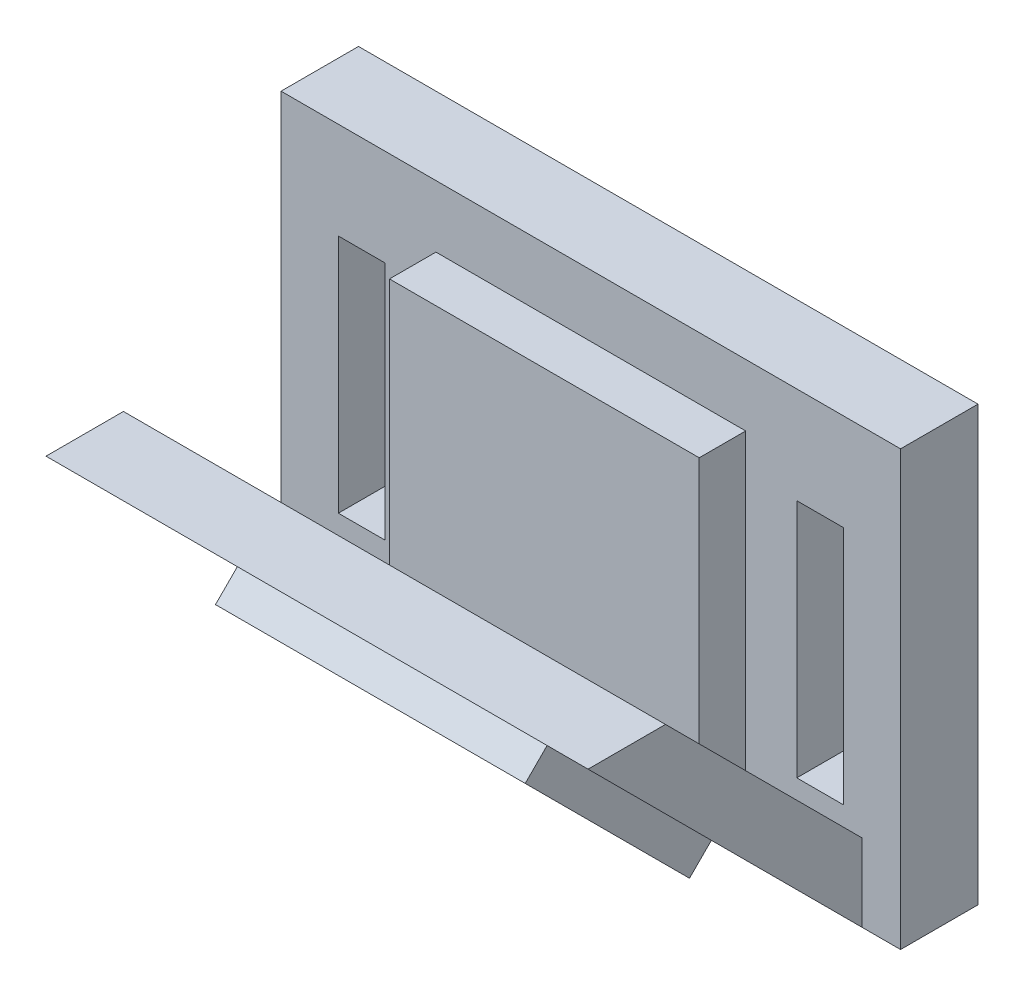
ISO-10303-21;
HEADER;
FILE_DESCRIPTION(('STEP AP214'),'2;1');
FILE_NAME('part.step','',(''),(''),'','','');
FILE_SCHEMA(('AUTOMOTIVE_DESIGN { 1 0 10303 214 1 1 1 1 }'));
ENDSEC;
DATA;
#1=APPLICATION_CONTEXT('core data for automotive mechanical design processes');
#2=APPLICATION_PROTOCOL_DEFINITION('international standard','automotive_design',2000,#1);
#3=PRODUCT_CONTEXT('',#1,'mechanical');
#4=PRODUCT('Part','Part','',(#3));
#5=PRODUCT_RELATED_PRODUCT_CATEGORY('part','',(#4));
#6=PRODUCT_DEFINITION_FORMATION('','',#4);
#7=PRODUCT_DEFINITION_CONTEXT('part definition',#1,'design');
#8=PRODUCT_DEFINITION('design','',#6,#7);
#9=PRODUCT_DEFINITION_SHAPE('','',#8);
#10=(LENGTH_UNIT() NAMED_UNIT(*) SI_UNIT(.MILLI.,.METRE.));
#11=(NAMED_UNIT(*) PLANE_ANGLE_UNIT() SI_UNIT($,.RADIAN.));
#12=(NAMED_UNIT(*) SI_UNIT($,.STERADIAN.) SOLID_ANGLE_UNIT());
#13=UNCERTAINTY_MEASURE_WITH_UNIT(LENGTH_MEASURE(1.E-05),#10,'distance_accuracy_value','');
#14=(GEOMETRIC_REPRESENTATION_CONTEXT(3) GLOBAL_UNCERTAINTY_ASSIGNED_CONTEXT((#13)) GLOBAL_UNIT_ASSIGNED_CONTEXT((#10,
#11,#12)) REPRESENTATION_CONTEXT('',''));
#15=CARTESIAN_POINT('',(0.,0.,0.));
#16=DIRECTION('',(0.,0.,1.));
#17=DIRECTION('',(1.,0.,0.));
#18=AXIS2_PLACEMENT_3D('',#15,#16,#17);
#19=CARTESIAN_POINT('',(17.5,-14.,2.5));
#20=DIRECTION('',(0.,0.707106781186544,-0.707106781186551));
#21=DIRECTION('',(0.,0.707106781186551,0.707106781186544));
#22=AXIS2_PLACEMENT_3D('',#19,#20,#21);
#23=PLANE('',#22);
#24=DIRECTION('',(0.,-0.707106781186551,-0.707106781186544));
#25=VECTOR('',#24,1.);
#26=CARTESIAN_POINT('',(-17.5,-14.,2.5));
#27=LINE('',#26,#25);
#28=CARTESIAN_POINT('',(-17.5,3.67766952966378,20.1776695296636));
#29=VERTEX_POINT('',#28);
#30=CARTESIAN_POINT('',(-17.5,-14.,2.5));
#31=VERTEX_POINT('',#30);
#32=EDGE_CURVE('E240',#29,#31,#27,.T.);
#33=ORIENTED_EDGE('',*,*,#32,.T.);
#34=DIRECTION('',(-1.,0.,0.));
#35=VECTOR('',#34,1.);
#36=CARTESIAN_POINT('',(17.5,-14.,2.5));
#37=LINE('',#36,#35);
#38=CARTESIAN_POINT('',(17.5,-14.,2.5));
#39=VERTEX_POINT('',#38);
#40=EDGE_CURVE('E249',#39,#31,#37,.T.);
#41=ORIENTED_EDGE('',*,*,#40,.F.);
#42=DIRECTION('',(0.,-0.707106781186551,-0.707106781186544));
#43=VECTOR('',#42,1.);
#44=CARTESIAN_POINT('',(17.5,-14.,2.5));
#45=LINE('',#44,#43);
#46=CARTESIAN_POINT('',(17.5,3.67766952966378,20.1776695296636));
#47=VERTEX_POINT('',#46);
#48=EDGE_CURVE('E246',#47,#39,#45,.T.);
#49=ORIENTED_EDGE('',*,*,#48,.F.);
#50=DIRECTION('',(-1.,0.,0.));
#51=VECTOR('',#50,1.);
#52=CARTESIAN_POINT('',(17.5,3.67766952966378,20.1776695296636));
#53=LINE('',#52,#51);
#54=EDGE_CURVE('E261',#47,#29,#53,.T.);
#55=ORIENTED_EDGE('',*,*,#54,.T.);
#56=EDGE_LOOP('',(#33,#41,#49,#55));
#57=FACE_BOUND('',#56,.T.);
#58=DIRECTION('',(0.,-0.707106781186551,-0.707106781186544));
#59=VECTOR('',#58,1.);
#60=CARTESIAN_POINT('',(-10.,-1.17893218813442,15.3210678118655));
#61=LINE('',#60,#59);
#62=CARTESIAN_POINT('',(-10.,-1.17893218813442,15.3210678118655));
#63=VERTEX_POINT('',#62);
#64=CARTESIAN_POINT('',(-10.,-11.7855339059327,4.71446609406729));
#65=VERTEX_POINT('',#64);
#66=EDGE_CURVE('E223',#63,#65,#61,.T.);
#67=ORIENTED_EDGE('',*,*,#66,.F.);
#68=DIRECTION('',(-1.,0.,0.));
#69=VECTOR('',#68,1.);
#70=CARTESIAN_POINT('',(-10.,-1.17893218813442,15.3210678118655));
#71=LINE('',#70,#69);
#72=CARTESIAN_POINT('',(10.,-1.17893218813442,15.3210678118655));
#73=VERTEX_POINT('',#72);
#74=EDGE_CURVE('E220',#73,#63,#71,.T.);
#75=ORIENTED_EDGE('',*,*,#74,.F.);
#76=DIRECTION('',(0.,0.707106781186551,0.707106781186544));
#77=VECTOR('',#76,1.);
#78=CARTESIAN_POINT('',(10.,-1.17893218813442,15.3210678118655));
#79=LINE('',#78,#77);
#80=CARTESIAN_POINT('',(10.,-11.7855339059327,4.71446609406729));
#81=VERTEX_POINT('',#80);
#82=EDGE_CURVE('E60',#81,#73,#79,.T.);
#83=ORIENTED_EDGE('',*,*,#82,.F.);
#84=DIRECTION('',(1.,0.,0.));
#85=VECTOR('',#84,1.);
#86=CARTESIAN_POINT('',(-10.,-11.7855339059327,4.71446609406729));
#87=LINE('',#86,#85);
#88=EDGE_CURVE('E55',#65,#81,#87,.T.);
#89=ORIENTED_EDGE('',*,*,#88,.F.);
#90=EDGE_LOOP('',(#67,#75,#83,#89));
#91=FACE_BOUND('',#90,.T.);
#92=ADVANCED_FACE('F39',(#57,#91),#23,.F.);
#93=CARTESIAN_POINT('',(0.,0.,2.5));
#94=DIRECTION('',(0.,0.,-1.));
#95=DIRECTION('',(-1.,0.,0.));
#96=AXIS2_PLACEMENT_3D('',#93,#94,#95);
#97=PLANE('',#96);
#98=DIRECTION('',(0.,1.,0.));
#99=VECTOR('',#98,1.);
#100=CARTESIAN_POINT('',(16.3,-7.74999999999999,2.5));
#101=LINE('',#100,#99);
#102=CARTESIAN_POINT('',(16.3,-7.74999999999999,2.5));
#103=VERTEX_POINT('',#102);
#104=CARTESIAN_POINT('',(16.3,7.75,2.5));
#105=VERTEX_POINT('',#104);
#106=EDGE_CURVE('E354',#103,#105,#101,.T.);
#107=ORIENTED_EDGE('',*,*,#106,.F.);
#108=DIRECTION('',(1.,0.,0.));
#109=VECTOR('',#108,1.);
#110=CARTESIAN_POINT('',(13.3,-7.74999999999999,2.5));
#111=LINE('',#110,#109);
#112=CARTESIAN_POINT('',(13.3,-7.74999999999999,2.5));
#113=VERTEX_POINT('',#112);
#114=EDGE_CURVE('E365',#113,#103,#111,.T.);
#115=ORIENTED_EDGE('',*,*,#114,.F.);
#116=DIRECTION('',(0.,-1.,0.));
#117=VECTOR('',#116,1.);
#118=CARTESIAN_POINT('',(13.3,-7.74999999999999,2.5));
#119=LINE('',#118,#117);
#120=CARTESIAN_POINT('',(13.3,7.75,2.5));
#121=VERTEX_POINT('',#120);
#122=EDGE_CURVE('E361',#121,#113,#119,.T.);
#123=ORIENTED_EDGE('',*,*,#122,.F.);
#124=DIRECTION('',(-1.,0.,0.));
#125=VECTOR('',#124,1.);
#126=CARTESIAN_POINT('',(13.3,7.75,2.5));
#127=LINE('',#126,#125);
#128=EDGE_CURVE('E357',#105,#121,#127,.T.);
#129=ORIENTED_EDGE('',*,*,#128,.F.);
#130=EDGE_LOOP('',(#107,#115,#123,#129));
#131=FACE_BOUND('',#130,.T.);
#132=DIRECTION('',(0.,1.,0.));
#133=VECTOR('',#132,1.);
#134=CARTESIAN_POINT('',(-13.3,-7.75,2.5));
#135=LINE('',#134,#133);
#136=CARTESIAN_POINT('',(-13.3,-7.75,2.5));
#137=VERTEX_POINT('',#136);
#138=CARTESIAN_POINT('',(-13.3,7.75,2.5));
#139=VERTEX_POINT('',#138);
#140=EDGE_CURVE('E311',#137,#139,#135,.T.);
#141=ORIENTED_EDGE('',*,*,#140,.F.);
#142=DIRECTION('',(1.,0.,0.));
#143=VECTOR('',#142,1.);
#144=CARTESIAN_POINT('',(-16.3,-7.75,2.5));
#145=LINE('',#144,#143);
#146=CARTESIAN_POINT('',(-16.3,-7.75,2.5));
#147=VERTEX_POINT('',#146);
#148=EDGE_CURVE('E322',#147,#137,#145,.T.);
#149=ORIENTED_EDGE('',*,*,#148,.F.);
#150=DIRECTION('',(0.,-1.,0.));
#151=VECTOR('',#150,1.);
#152=CARTESIAN_POINT('',(-16.3,-7.75,2.5));
#153=LINE('',#152,#151);
#154=CARTESIAN_POINT('',(-16.3,7.75,2.5));
#155=VERTEX_POINT('',#154);
#156=EDGE_CURVE('E318',#155,#147,#153,.T.);
#157=ORIENTED_EDGE('',*,*,#156,.F.);
#158=DIRECTION('',(-1.,0.,0.));
#159=VECTOR('',#158,1.);
#160=CARTESIAN_POINT('',(-16.3,7.75,2.5));
#161=LINE('',#160,#159);
#162=EDGE_CURVE('E314',#139,#155,#161,.T.);
#163=ORIENTED_EDGE('',*,*,#162,.F.);
#164=EDGE_LOOP('',(#141,#149,#157,#163));
#165=FACE_BOUND('',#164,.T.);
#166=DIRECTION('',(-1.,0.,0.));
#167=VECTOR('',#166,1.);
#168=CARTESIAN_POINT('',(17.5,-8.99999999999996,2.5));
#169=LINE('',#168,#167);
#170=CARTESIAN_POINT('',(17.5,-8.99999999999996,2.5));
#171=VERTEX_POINT('',#170);
#172=CARTESIAN_POINT('',(10.,-8.99999999999996,2.5));
#173=VERTEX_POINT('',#172);
#174=EDGE_CURVE('E270',#171,#173,#169,.T.);
#175=ORIENTED_EDGE('',*,*,#174,.F.);
#176=DIRECTION('',(0.,1.,0.));
#177=VECTOR('',#176,1.);
#178=CARTESIAN_POINT('',(17.5,-8.99999999999996,2.5));
#179=LINE('',#178,#177);
#180=EDGE_CURVE('E235',#39,#171,#179,.T.);
#181=ORIENTED_EDGE('',*,*,#180,.F.);
#182=DIRECTION('',(1.,0.,0.));
#183=VECTOR('',#182,1.);
#184=CARTESIAN_POINT('',(-20.,-14.,2.5));
#185=LINE('',#184,#183);
#186=CARTESIAN_POINT('',(20.,-14.,2.5));
#187=VERTEX_POINT('',#186);
#188=EDGE_CURVE('E408',#39,#187,#185,.T.);
#189=ORIENTED_EDGE('',*,*,#188,.T.);
#190=DIRECTION('',(0.,1.,0.));
#191=VECTOR('',#190,1.);
#192=CARTESIAN_POINT('',(20.,-14.,2.5));
#193=LINE('',#192,#191);
#194=CARTESIAN_POINT('',(20.,14.,2.5));
#195=VERTEX_POINT('',#194);
#196=EDGE_CURVE('E397',#187,#195,#193,.T.);
#197=ORIENTED_EDGE('',*,*,#196,.T.);
#198=DIRECTION('',(-1.,0.,0.));
#199=VECTOR('',#198,1.);
#200=CARTESIAN_POINT('',(-20.,14.,2.5));
#201=LINE('',#200,#199);
#202=CARTESIAN_POINT('',(-20.,14.,2.5));
#203=VERTEX_POINT('',#202);
#204=EDGE_CURVE('E401',#195,#203,#201,.T.);
#205=ORIENTED_EDGE('',*,*,#204,.T.);
#206=DIRECTION('',(0.,-1.,0.));
#207=VECTOR('',#206,1.);
#208=CARTESIAN_POINT('',(-20.,-14.,2.5));
#209=LINE('',#208,#207);
#210=CARTESIAN_POINT('',(-20.,-14.,2.5));
#211=VERTEX_POINT('',#210);
#212=EDGE_CURVE('E405',#203,#211,#209,.T.);
#213=ORIENTED_EDGE('',*,*,#212,.T.);
#214=EDGE_CURVE('E409',#211,#31,#185,.T.);
#215=ORIENTED_EDGE('',*,*,#214,.T.);
#216=DIRECTION('',(0.,1.,0.));
#217=VECTOR('',#216,1.);
#218=CARTESIAN_POINT('',(-17.5,-8.99999999999996,2.5));
#219=LINE('',#218,#217);
#220=CARTESIAN_POINT('',(-17.5,-8.99999999999996,2.5));
#221=VERTEX_POINT('',#220);
#222=EDGE_CURVE('E225',#31,#221,#219,.T.);
#223=ORIENTED_EDGE('',*,*,#222,.T.);
#224=CARTESIAN_POINT('',(-10.,-8.99999999999996,2.5));
#225=VERTEX_POINT('',#224);
#226=EDGE_CURVE('E269',#225,#221,#169,.T.);
#227=ORIENTED_EDGE('',*,*,#226,.F.);
#228=DIRECTION('',(0.,-1.,0.));
#229=VECTOR('',#228,1.);
#230=CARTESIAN_POINT('',(-10.,-10.,2.5));
#231=LINE('',#230,#229);
#232=CARTESIAN_POINT('',(-10.,10.,2.5));
#233=VERTEX_POINT('',#232);
#234=EDGE_CURVE('E287',#233,#225,#231,.T.);
#235=ORIENTED_EDGE('',*,*,#234,.F.);
#236=DIRECTION('',(-1.,0.,0.));
#237=VECTOR('',#236,1.);
#238=CARTESIAN_POINT('',(-10.,10.,2.5));
#239=LINE('',#238,#237);
#240=CARTESIAN_POINT('',(10.,10.,2.5));
#241=VERTEX_POINT('',#240);
#242=EDGE_CURVE('E296',#241,#233,#239,.T.);
#243=ORIENTED_EDGE('',*,*,#242,.F.);
#244=DIRECTION('',(0.,1.,0.));
#245=VECTOR('',#244,1.);
#246=CARTESIAN_POINT('',(10.,-10.,2.5));
#247=LINE('',#246,#245);
#248=EDGE_CURVE('E282',#173,#241,#247,.T.);
#249=ORIENTED_EDGE('',*,*,#248,.F.);
#250=EDGE_LOOP('',(#175,#181,#189,#197,#205,#213,#215,#223,#227,#235,#243,#249));
#251=FACE_BOUND('',#250,.T.);
#252=ADVANCED_FACE('F460',(#131,#165,#251),#97,.F.);
#253=CARTESIAN_POINT('',(10.,-10.,5.5));
#254=DIRECTION('',(-1.,0.,0.));
#255=DIRECTION('',(0.,0.,1.));
#256=AXIS2_PLACEMENT_3D('',#253,#254,#255);
#257=PLANE('',#256);
#258=DIRECTION('',(0.,0.707106781186551,0.707106781186544));
#259=VECTOR('',#258,1.);
#260=CARTESIAN_POINT('',(10.,-7.99999999999998,3.49999999999996));
#261=LINE('',#260,#259);
#262=CARTESIAN_POINT('',(10.,-5.99999999999993,5.5));
#263=VERTEX_POINT('',#262);
#264=EDGE_CURVE('E278',#173,#263,#261,.T.);
#265=ORIENTED_EDGE('',*,*,#264,.F.);
#266=ORIENTED_EDGE('',*,*,#248,.T.);
#267=DIRECTION('',(0.,0.,-1.));
#268=VECTOR('',#267,1.);
#269=CARTESIAN_POINT('',(10.,10.,5.5));
#270=LINE('',#269,#268);
#271=CARTESIAN_POINT('',(10.,10.,5.5));
#272=VERTEX_POINT('',#271);
#273=EDGE_CURVE('E306',#272,#241,#270,.T.);
#274=ORIENTED_EDGE('',*,*,#273,.F.);
#275=DIRECTION('',(0.,1.,0.));
#276=VECTOR('',#275,1.);
#277=CARTESIAN_POINT('',(10.,-10.,5.5));
#278=LINE('',#277,#276);
#279=EDGE_CURVE('E283',#263,#272,#278,.T.);
#280=ORIENTED_EDGE('',*,*,#279,.F.);
#281=EDGE_LOOP('',(#265,#266,#274,#280));
#282=FACE_BOUND('',#281,.T.);
#283=ADVANCED_FACE('F484',(#282),#257,.F.);
#284=CARTESIAN_POINT('',(-10.,-10.,5.5));
#285=DIRECTION('',(1.,0.,0.));
#286=DIRECTION('',(0.,0.,-1.));
#287=AXIS2_PLACEMENT_3D('',#284,#285,#286);
#288=PLANE('',#287);
#289=DIRECTION('',(0.,-0.707106781186551,-0.707106781186544));
#290=VECTOR('',#289,1.);
#291=CARTESIAN_POINT('',(-10.,-7.99999999999998,3.49999999999996));
#292=LINE('',#291,#290);
#293=CARTESIAN_POINT('',(-10.,-5.99999999999993,5.5));
#294=VERTEX_POINT('',#293);
#295=EDGE_CURVE('E274',#294,#225,#292,.T.);
#296=ORIENTED_EDGE('',*,*,#295,.F.);
#297=DIRECTION('',(0.,-1.,0.));
#298=VECTOR('',#297,1.);
#299=CARTESIAN_POINT('',(-10.,-10.,5.5));
#300=LINE('',#299,#298);
#301=CARTESIAN_POINT('',(-10.,10.,5.5));
#302=VERTEX_POINT('',#301);
#303=EDGE_CURVE('E290',#302,#294,#300,.T.);
#304=ORIENTED_EDGE('',*,*,#303,.F.);
#305=DIRECTION('',(0.,0.,-1.));
#306=VECTOR('',#305,1.);
#307=CARTESIAN_POINT('',(-10.,10.,5.5));
#308=LINE('',#307,#306);
#309=EDGE_CURVE('E293',#302,#233,#308,.T.);
#310=ORIENTED_EDGE('',*,*,#309,.T.);
#311=ORIENTED_EDGE('',*,*,#234,.T.);
#312=EDGE_LOOP('',(#296,#304,#310,#311));
#313=FACE_BOUND('',#312,.T.);
#314=ADVANCED_FACE('F495',(#313),#288,.F.);
#315=CARTESIAN_POINT('',(0.,0.,5.5));
#316=DIRECTION('',(0.,0.,-1.));
#317=DIRECTION('',(-1.,0.,0.));
#318=AXIS2_PLACEMENT_3D('',#315,#316,#317);
#319=PLANE('',#318);
#320=DIRECTION('',(-1.,0.,0.));
#321=VECTOR('',#320,1.);
#322=CARTESIAN_POINT('',(0.,-5.99999999999993,5.5));
#323=LINE('',#322,#321);
#324=EDGE_CURVE('E11',#263,#294,#323,.T.);
#325=ORIENTED_EDGE('',*,*,#324,.F.);
#326=ORIENTED_EDGE('',*,*,#279,.T.);
#327=DIRECTION('',(-1.,0.,0.));
#328=VECTOR('',#327,1.);
#329=CARTESIAN_POINT('',(-10.,10.,5.5));
#330=LINE('',#329,#328);
#331=EDGE_CURVE('E286',#272,#302,#330,.T.);
#332=ORIENTED_EDGE('',*,*,#331,.T.);
#333=ORIENTED_EDGE('',*,*,#303,.T.);
#334=EDGE_LOOP('',(#325,#326,#332,#333));
#335=FACE_BOUND('',#334,.T.);
#336=ADVANCED_FACE('F488',(#335),#319,.F.);
#337=CARTESIAN_POINT('',(0.,0.,-2.5));
#338=DIRECTION('',(0.,0.,-1.));
#339=DIRECTION('',(-1.,0.,0.));
#340=AXIS2_PLACEMENT_3D('',#337,#338,#339);
#341=PLANE('',#340);
#342=DIRECTION('',(0.,1.,0.));
#343=VECTOR('',#342,1.);
#344=CARTESIAN_POINT('',(20.,-14.,-2.5));
#345=LINE('',#344,#343);
#346=CARTESIAN_POINT('',(20.,-14.,-2.5));
#347=VERTEX_POINT('',#346);
#348=CARTESIAN_POINT('',(20.,14.,-2.5));
#349=VERTEX_POINT('',#348);
#350=EDGE_CURVE('E396',#347,#349,#345,.T.);
#351=ORIENTED_EDGE('',*,*,#350,.F.);
#352=DIRECTION('',(1.,0.,0.));
#353=VECTOR('',#352,1.);
#354=CARTESIAN_POINT('',(-20.,-14.,-2.5));
#355=LINE('',#354,#353);
#356=CARTESIAN_POINT('',(-20.,-14.,-2.5));
#357=VERTEX_POINT('',#356);
#358=EDGE_CURVE('E402',#357,#347,#355,.T.);
#359=ORIENTED_EDGE('',*,*,#358,.F.);
#360=DIRECTION('',(0.,-1.,0.));
#361=VECTOR('',#360,1.);
#362=CARTESIAN_POINT('',(-20.,-14.,-2.5));
#363=LINE('',#362,#361);
#364=CARTESIAN_POINT('',(-20.,14.,-2.5));
#365=VERTEX_POINT('',#364);
#366=EDGE_CURVE('E420',#365,#357,#363,.T.);
#367=ORIENTED_EDGE('',*,*,#366,.F.);
#368=DIRECTION('',(-1.,0.,0.));
#369=VECTOR('',#368,1.);
#370=CARTESIAN_POINT('',(-20.,14.,-2.5));
#371=LINE('',#370,#369);
#372=EDGE_CURVE('E417',#349,#365,#371,.T.);
#373=ORIENTED_EDGE('',*,*,#372,.F.);
#374=EDGE_LOOP('',(#351,#359,#367,#373));
#375=FACE_BOUND('',#374,.T.);
#376=DIRECTION('',(1.,0.,0.));
#377=VECTOR('',#376,1.);
#378=CARTESIAN_POINT('',(13.3,-7.74999999999999,-2.5));
#379=LINE('',#378,#377);
#380=CARTESIAN_POINT('',(13.3,-7.74999999999999,-2.5));
#381=VERTEX_POINT('',#380);
#382=CARTESIAN_POINT('',(16.3,-7.74999999999999,-2.5));
#383=VERTEX_POINT('',#382);
#384=EDGE_CURVE('E358',#381,#383,#379,.T.);
#385=ORIENTED_EDGE('',*,*,#384,.T.);
#386=DIRECTION('',(0.,1.,0.));
#387=VECTOR('',#386,1.);
#388=CARTESIAN_POINT('',(16.3,-7.74999999999999,-2.5));
#389=LINE('',#388,#387);
#390=CARTESIAN_POINT('',(16.3,7.75,-2.5));
#391=VERTEX_POINT('',#390);
#392=EDGE_CURVE('E353',#383,#391,#389,.T.);
#393=ORIENTED_EDGE('',*,*,#392,.T.);
#394=DIRECTION('',(-1.,0.,0.));
#395=VECTOR('',#394,1.);
#396=CARTESIAN_POINT('',(13.3,7.75,-2.5));
#397=LINE('',#396,#395);
#398=CARTESIAN_POINT('',(13.3,7.75,-2.5));
#399=VERTEX_POINT('',#398);
#400=EDGE_CURVE('E372',#391,#399,#397,.T.);
#401=ORIENTED_EDGE('',*,*,#400,.T.);
#402=DIRECTION('',(0.,-1.,0.));
#403=VECTOR('',#402,1.);
#404=CARTESIAN_POINT('',(13.3,-7.74999999999999,-2.5));
#405=LINE('',#404,#403);
#406=EDGE_CURVE('E376',#399,#381,#405,.T.);
#407=ORIENTED_EDGE('',*,*,#406,.T.);
#408=EDGE_LOOP('',(#385,#393,#401,#407));
#409=FACE_BOUND('',#408,.T.);
#410=DIRECTION('',(1.,0.,0.));
#411=VECTOR('',#410,1.);
#412=CARTESIAN_POINT('',(-16.3,-7.75,-2.5));
#413=LINE('',#412,#411);
#414=CARTESIAN_POINT('',(-16.3,-7.75,-2.5));
#415=VERTEX_POINT('',#414);
#416=CARTESIAN_POINT('',(-13.3,-7.75,-2.5));
#417=VERTEX_POINT('',#416);
#418=EDGE_CURVE('E315',#415,#417,#413,.T.);
#419=ORIENTED_EDGE('',*,*,#418,.T.);
#420=DIRECTION('',(0.,1.,0.));
#421=VECTOR('',#420,1.);
#422=CARTESIAN_POINT('',(-13.3,-7.75,-2.5));
#423=LINE('',#422,#421);
#424=CARTESIAN_POINT('',(-13.3,7.75,-2.5));
#425=VERTEX_POINT('',#424);
#426=EDGE_CURVE('E310',#417,#425,#423,.T.);
#427=ORIENTED_EDGE('',*,*,#426,.T.);
#428=DIRECTION('',(-1.,0.,0.));
#429=VECTOR('',#428,1.);
#430=CARTESIAN_POINT('',(-16.3,7.75,-2.5));
#431=LINE('',#430,#429);
#432=CARTESIAN_POINT('',(-16.3,7.75,-2.5));
#433=VERTEX_POINT('',#432);
#434=EDGE_CURVE('E329',#425,#433,#431,.T.);
#435=ORIENTED_EDGE('',*,*,#434,.T.);
#436=DIRECTION('',(0.,-1.,0.));
#437=VECTOR('',#436,1.);
#438=CARTESIAN_POINT('',(-16.3,-7.75,-2.5));
#439=LINE('',#438,#437);
#440=EDGE_CURVE('E333',#433,#415,#439,.T.);
#441=ORIENTED_EDGE('',*,*,#440,.T.);
#442=EDGE_LOOP('',(#419,#427,#435,#441));
#443=FACE_BOUND('',#442,.T.);
#444=ADVANCED_FACE('F447',(#375,#409,#443),#341,.T.);
#445=CARTESIAN_POINT('',(20.,-14.,2.5));
#446=DIRECTION('',(-1.,0.,0.));
#447=DIRECTION('',(0.,0.,1.));
#448=AXIS2_PLACEMENT_3D('',#445,#446,#447);
#449=PLANE('',#448);
#450=ORIENTED_EDGE('',*,*,#350,.T.);
#451=DIRECTION('',(0.,0.,-1.));
#452=VECTOR('',#451,1.);
#453=CARTESIAN_POINT('',(20.,14.,2.5));
#454=LINE('',#453,#452);
#455=EDGE_CURVE('E48',#195,#349,#454,.T.);
#456=ORIENTED_EDGE('',*,*,#455,.F.);
#457=ORIENTED_EDGE('',*,*,#196,.F.);
#458=DIRECTION('',(0.,0.,-1.));
#459=VECTOR('',#458,1.);
#460=CARTESIAN_POINT('',(20.,-14.,2.5));
#461=LINE('',#460,#459);
#462=EDGE_CURVE('E413',#187,#347,#461,.T.);
#463=ORIENTED_EDGE('',*,*,#462,.T.);
#464=EDGE_LOOP('',(#450,#456,#457,#463));
#465=FACE_BOUND('',#464,.T.);
#466=ADVANCED_FACE('F41',(#465),#449,.F.);
#467=CARTESIAN_POINT('',(-20.,14.,2.5));
#468=DIRECTION('',(0.,-1.,0.));
#469=DIRECTION('',(0.,0.,-1.));
#470=AXIS2_PLACEMENT_3D('',#467,#468,#469);
#471=PLANE('',#470);
#472=ORIENTED_EDGE('',*,*,#372,.T.);
#473=DIRECTION('',(0.,0.,-1.));
#474=VECTOR('',#473,1.);
#475=CARTESIAN_POINT('',(-20.,14.,2.5));
#476=LINE('',#475,#474);
#477=EDGE_CURVE('E432',#203,#365,#476,.T.);
#478=ORIENTED_EDGE('',*,*,#477,.F.);
#479=ORIENTED_EDGE('',*,*,#204,.F.);
#480=ORIENTED_EDGE('',*,*,#455,.T.);
#481=EDGE_LOOP('',(#472,#478,#479,#480));
#482=FACE_BOUND('',#481,.T.);
#483=ADVANCED_FACE('F439',(#482),#471,.F.);
#484=CARTESIAN_POINT('',(-20.,-14.,2.5));
#485=DIRECTION('',(1.,0.,0.));
#486=DIRECTION('',(0.,0.,-1.));
#487=AXIS2_PLACEMENT_3D('',#484,#485,#486);
#488=PLANE('',#487);
#489=ORIENTED_EDGE('',*,*,#366,.T.);
#490=DIRECTION('',(0.,0.,-1.));
#491=VECTOR('',#490,1.);
#492=CARTESIAN_POINT('',(-20.,-14.,2.5));
#493=LINE('',#492,#491);
#494=EDGE_CURVE('E428',#211,#357,#493,.T.);
#495=ORIENTED_EDGE('',*,*,#494,.F.);
#496=ORIENTED_EDGE('',*,*,#212,.F.);
#497=ORIENTED_EDGE('',*,*,#477,.T.);
#498=EDGE_LOOP('',(#489,#495,#496,#497));
#499=FACE_BOUND('',#498,.T.);
#500=ADVANCED_FACE('F452',(#499),#488,.F.);
#501=CARTESIAN_POINT('',(-20.,-14.,2.5));
#502=DIRECTION('',(0.,1.,0.));
#503=DIRECTION('',(0.,0.,1.));
#504=AXIS2_PLACEMENT_3D('',#501,#502,#503);
#505=PLANE('',#504);
#506=ORIENTED_EDGE('',*,*,#358,.T.);
#507=ORIENTED_EDGE('',*,*,#462,.F.);
#508=ORIENTED_EDGE('',*,*,#188,.F.);
#509=ORIENTED_EDGE('',*,*,#40,.T.);
#510=ORIENTED_EDGE('',*,*,#214,.F.);
#511=ORIENTED_EDGE('',*,*,#494,.T.);
#512=EDGE_LOOP('',(#506,#507,#508,#509,#510,#511));
#513=FACE_BOUND('',#512,.T.);
#514=ADVANCED_FACE('F456',(#513),#505,.F.);
#515=CARTESIAN_POINT('',(16.3,-7.74999999999999,2.5));
#516=DIRECTION('',(-1.,0.,0.));
#517=DIRECTION('',(0.,0.,1.));
#518=AXIS2_PLACEMENT_3D('',#515,#516,#517);
#519=PLANE('',#518);
#520=ORIENTED_EDGE('',*,*,#392,.F.);
#521=DIRECTION('',(0.,0.,-1.));
#522=VECTOR('',#521,1.);
#523=CARTESIAN_POINT('',(16.3,-7.74999999999999,2.5));
#524=LINE('',#523,#522);
#525=EDGE_CURVE('E368',#103,#383,#524,.T.);
#526=ORIENTED_EDGE('',*,*,#525,.F.);
#527=ORIENTED_EDGE('',*,*,#106,.T.);
#528=DIRECTION('',(0.,0.,-1.));
#529=VECTOR('',#528,1.);
#530=CARTESIAN_POINT('',(16.3,7.75,2.5));
#531=LINE('',#530,#529);
#532=EDGE_CURVE('E392',#105,#391,#531,.T.);
#533=ORIENTED_EDGE('',*,*,#532,.T.);
#534=EDGE_LOOP('',(#520,#526,#527,#533));
#535=FACE_BOUND('',#534,.T.);
#536=ADVANCED_FACE('F555',(#535),#519,.T.);
#537=CARTESIAN_POINT('',(13.3,7.75,2.5));
#538=DIRECTION('',(0.,-1.,0.));
#539=DIRECTION('',(0.,0.,-1.));
#540=AXIS2_PLACEMENT_3D('',#537,#538,#539);
#541=PLANE('',#540);
#542=ORIENTED_EDGE('',*,*,#400,.F.);
#543=ORIENTED_EDGE('',*,*,#532,.F.);
#544=ORIENTED_EDGE('',*,*,#128,.T.);
#545=DIRECTION('',(0.,0.,-1.));
#546=VECTOR('',#545,1.);
#547=CARTESIAN_POINT('',(13.3,7.75,2.5));
#548=LINE('',#547,#546);
#549=EDGE_CURVE('E389',#121,#399,#548,.T.);
#550=ORIENTED_EDGE('',*,*,#549,.T.);
#551=EDGE_LOOP('',(#542,#543,#544,#550));
#552=FACE_BOUND('',#551,.T.);
#553=ADVANCED_FACE('F551',(#552),#541,.T.);
#554=CARTESIAN_POINT('',(13.3,-7.74999999999999,2.5));
#555=DIRECTION('',(1.,0.,0.));
#556=DIRECTION('',(0.,0.,-1.));
#557=AXIS2_PLACEMENT_3D('',#554,#555,#556);
#558=PLANE('',#557);
#559=ORIENTED_EDGE('',*,*,#406,.F.);
#560=ORIENTED_EDGE('',*,*,#549,.F.);
#561=ORIENTED_EDGE('',*,*,#122,.T.);
#562=DIRECTION('',(0.,0.,-1.));
#563=VECTOR('',#562,1.);
#564=CARTESIAN_POINT('',(13.3,-7.74999999999999,2.5));
#565=LINE('',#564,#563);
#566=EDGE_CURVE('E386',#113,#381,#565,.T.);
#567=ORIENTED_EDGE('',*,*,#566,.T.);
#568=EDGE_LOOP('',(#559,#560,#561,#567));
#569=FACE_BOUND('',#568,.T.);
#570=ADVANCED_FACE('F547',(#569),#558,.T.);
#571=CARTESIAN_POINT('',(13.3,-7.74999999999999,2.5));
#572=DIRECTION('',(0.,1.,0.));
#573=DIRECTION('',(-1.,0.,0.));
#574=AXIS2_PLACEMENT_3D('',#571,#572,#573);
#575=PLANE('',#574);
#576=ORIENTED_EDGE('',*,*,#384,.F.);
#577=ORIENTED_EDGE('',*,*,#566,.F.);
#578=ORIENTED_EDGE('',*,*,#114,.T.);
#579=ORIENTED_EDGE('',*,*,#525,.T.);
#580=EDGE_LOOP('',(#576,#577,#578,#579));
#581=FACE_BOUND('',#580,.T.);
#582=ADVANCED_FACE('F543',(#581),#575,.T.);
#583=CARTESIAN_POINT('',(-13.3,-7.75,2.5));
#584=DIRECTION('',(-1.,0.,0.));
#585=DIRECTION('',(0.,0.,1.));
#586=AXIS2_PLACEMENT_3D('',#583,#584,#585);
#587=PLANE('',#586);
#588=ORIENTED_EDGE('',*,*,#426,.F.);
#589=DIRECTION('',(0.,0.,-1.));
#590=VECTOR('',#589,1.);
#591=CARTESIAN_POINT('',(-13.3,-7.75,2.5));
#592=LINE('',#591,#590);
#593=EDGE_CURVE('E325',#137,#417,#592,.T.);
#594=ORIENTED_EDGE('',*,*,#593,.F.);
#595=ORIENTED_EDGE('',*,*,#140,.T.);
#596=DIRECTION('',(0.,0.,-1.));
#597=VECTOR('',#596,1.);
#598=CARTESIAN_POINT('',(-13.3,7.75,2.5));
#599=LINE('',#598,#597);
#600=EDGE_CURVE('E349',#139,#425,#599,.T.);
#601=ORIENTED_EDGE('',*,*,#600,.T.);
#602=EDGE_LOOP('',(#588,#594,#595,#601));
#603=FACE_BOUND('',#602,.T.);
#604=ADVANCED_FACE('F539',(#603),#587,.T.);
#605=CARTESIAN_POINT('',(-16.3,7.75,2.5));
#606=DIRECTION('',(0.,-1.,0.));
#607=DIRECTION('',(0.,0.,-1.));
#608=AXIS2_PLACEMENT_3D('',#605,#606,#607);
#609=PLANE('',#608);
#610=ORIENTED_EDGE('',*,*,#434,.F.);
#611=ORIENTED_EDGE('',*,*,#600,.F.);
#612=ORIENTED_EDGE('',*,*,#162,.T.);
#613=DIRECTION('',(0.,0.,-1.));
#614=VECTOR('',#613,1.);
#615=CARTESIAN_POINT('',(-16.3,7.75,2.5));
#616=LINE('',#615,#614);
#617=EDGE_CURVE('E346',#155,#433,#616,.T.);
#618=ORIENTED_EDGE('',*,*,#617,.T.);
#619=EDGE_LOOP('',(#610,#611,#612,#618));
#620=FACE_BOUND('',#619,.T.);
#621=ADVANCED_FACE('F535',(#620),#609,.T.);
#622=CARTESIAN_POINT('',(-16.3,-7.75,2.5));
#623=DIRECTION('',(1.,0.,0.));
#624=DIRECTION('',(0.,0.,-1.));
#625=AXIS2_PLACEMENT_3D('',#622,#623,#624);
#626=PLANE('',#625);
#627=ORIENTED_EDGE('',*,*,#440,.F.);
#628=ORIENTED_EDGE('',*,*,#617,.F.);
#629=ORIENTED_EDGE('',*,*,#156,.T.);
#630=DIRECTION('',(0.,0.,-1.));
#631=VECTOR('',#630,1.);
#632=CARTESIAN_POINT('',(-16.3,-7.75,2.5));
#633=LINE('',#632,#631);
#634=EDGE_CURVE('E343',#147,#415,#633,.T.);
#635=ORIENTED_EDGE('',*,*,#634,.T.);
#636=EDGE_LOOP('',(#627,#628,#629,#635));
#637=FACE_BOUND('',#636,.T.);
#638=ADVANCED_FACE('F529',(#637),#626,.T.);
#639=CARTESIAN_POINT('',(-16.3,-7.75,2.5));
#640=DIRECTION('',(0.,1.,0.));
#641=DIRECTION('',(0.,0.,1.));
#642=AXIS2_PLACEMENT_3D('',#639,#640,#641);
#643=PLANE('',#642);
#644=ORIENTED_EDGE('',*,*,#418,.F.);
#645=ORIENTED_EDGE('',*,*,#634,.F.);
#646=ORIENTED_EDGE('',*,*,#148,.T.);
#647=ORIENTED_EDGE('',*,*,#593,.T.);
#648=EDGE_LOOP('',(#644,#645,#646,#647));
#649=FACE_BOUND('',#648,.T.);
#650=ADVANCED_FACE('F524',(#649),#643,.T.);
#651=CARTESIAN_POINT('',(-10.,10.,5.5));
#652=DIRECTION('',(0.,-1.,0.));
#653=DIRECTION('',(0.,0.,-1.));
#654=AXIS2_PLACEMENT_3D('',#651,#652,#653);
#655=PLANE('',#654);
#656=ORIENTED_EDGE('',*,*,#242,.T.);
#657=ORIENTED_EDGE('',*,*,#309,.F.);
#658=ORIENTED_EDGE('',*,*,#331,.F.);
#659=ORIENTED_EDGE('',*,*,#273,.T.);
#660=EDGE_LOOP('',(#656,#657,#658,#659));
#661=FACE_BOUND('',#660,.T.);
#662=ADVANCED_FACE('F491',(#661),#655,.F.);
#663=CARTESIAN_POINT('',(17.5,3.67766952966378,15.1776695296636));
#664=DIRECTION('',(0.,-0.707106781186544,0.707106781186551));
#665=DIRECTION('',(0.,-0.707106781186551,-0.707106781186544));
#666=AXIS2_PLACEMENT_3D('',#663,#664,#665);
#667=PLANE('',#666);
#668=ORIENTED_EDGE('',*,*,#174,.T.);
#669=ORIENTED_EDGE('',*,*,#264,.T.);
#670=ORIENTED_EDGE('',*,*,#324,.T.);
#671=ORIENTED_EDGE('',*,*,#295,.T.);
#672=ORIENTED_EDGE('',*,*,#226,.T.);
#673=DIRECTION('',(0.,0.707106781186551,0.707106781186544));
#674=VECTOR('',#673,1.);
#675=CARTESIAN_POINT('',(-17.5,3.67766952966378,15.1776695296636));
#676=LINE('',#675,#674);
#677=CARTESIAN_POINT('',(-17.5,3.67766952966378,15.1776695296636));
#678=VERTEX_POINT('',#677);
#679=EDGE_CURVE('E229',#221,#678,#676,.T.);
#680=ORIENTED_EDGE('',*,*,#679,.T.);
#681=DIRECTION('',(-1.,0.,0.));
#682=VECTOR('',#681,1.);
#683=CARTESIAN_POINT('',(17.5,3.67766952966378,15.1776695296636));
#684=LINE('',#683,#682);
#685=CARTESIAN_POINT('',(17.5,3.67766952966378,15.1776695296636));
#686=VERTEX_POINT('',#685);
#687=EDGE_CURVE('E265',#686,#678,#684,.T.);
#688=ORIENTED_EDGE('',*,*,#687,.F.);
#689=DIRECTION('',(0.,0.707106781186551,0.707106781186544));
#690=VECTOR('',#689,1.);
#691=CARTESIAN_POINT('',(17.5,3.67766952966378,15.1776695296636));
#692=LINE('',#691,#690);
#693=EDGE_CURVE('E239',#171,#686,#692,.T.);
#694=ORIENTED_EDGE('',*,*,#693,.F.);
#695=EDGE_LOOP('',(#668,#669,#670,#671,#672,#680,#688,#694));
#696=FACE_BOUND('',#695,.T.);
#697=ADVANCED_FACE('F473',(#696),#667,.F.);
#698=CARTESIAN_POINT('',(17.5,3.67766952966378,20.1776695296636));
#699=DIRECTION('',(0.,-1.,0.));
#700=DIRECTION('',(0.,0.,-1.));
#701=AXIS2_PLACEMENT_3D('',#698,#699,#700);
#702=PLANE('',#701);
#703=DIRECTION('',(0.,0.,1.));
#704=VECTOR('',#703,1.);
#705=CARTESIAN_POINT('',(-17.5,3.67766952966378,20.1776695296636));
#706=LINE('',#705,#704);
#707=EDGE_CURVE('E253',#678,#29,#706,.T.);
#708=ORIENTED_EDGE('',*,*,#707,.T.);
#709=ORIENTED_EDGE('',*,*,#54,.F.);
#710=DIRECTION('',(0.,0.,1.));
#711=VECTOR('',#710,1.);
#712=CARTESIAN_POINT('',(17.5,3.67766952966378,20.1776695296636));
#713=LINE('',#712,#711);
#714=EDGE_CURVE('E243',#686,#47,#713,.T.);
#715=ORIENTED_EDGE('',*,*,#714,.F.);
#716=ORIENTED_EDGE('',*,*,#687,.T.);
#717=EDGE_LOOP('',(#708,#709,#715,#716));
#718=FACE_BOUND('',#717,.T.);
#719=ADVANCED_FACE('F477',(#718),#702,.F.);
#720=CARTESIAN_POINT('',(17.5,0.,0.));
#721=DIRECTION('',(1.,0.,0.));
#722=DIRECTION('',(0.,0.,-1.));
#723=AXIS2_PLACEMENT_3D('',#720,#721,#722);
#724=PLANE('',#723);
#725=ORIENTED_EDGE('',*,*,#180,.T.);
#726=ORIENTED_EDGE('',*,*,#693,.T.);
#727=ORIENTED_EDGE('',*,*,#714,.T.);
#728=ORIENTED_EDGE('',*,*,#48,.T.);
#729=EDGE_LOOP('',(#725,#726,#727,#728));
#730=FACE_BOUND('',#729,.T.);
#731=ADVANCED_FACE('F479',(#730),#724,.T.);
#732=CARTESIAN_POINT('',(-17.5,0.,0.));
#733=DIRECTION('',(1.,0.,0.));
#734=DIRECTION('',(0.,0.,-1.));
#735=AXIS2_PLACEMENT_3D('',#732,#733,#734);
#736=PLANE('',#735);
#737=ORIENTED_EDGE('',*,*,#222,.F.);
#738=ORIENTED_EDGE('',*,*,#32,.F.);
#739=ORIENTED_EDGE('',*,*,#707,.F.);
#740=ORIENTED_EDGE('',*,*,#679,.F.);
#741=EDGE_LOOP('',(#737,#738,#739,#740));
#742=FACE_BOUND('',#741,.T.);
#743=ADVANCED_FACE('F470',(#742),#736,.F.);
#744=CARTESIAN_POINT('',(-10.,-2.59314575050751,16.7352813742386));
#745=DIRECTION('',(1.,0.,0.));
#746=DIRECTION('',(0.,1.,0.));
#747=AXIS2_PLACEMENT_3D('',#744,#745,#746);
#748=PLANE('',#747);
#749=ORIENTED_EDGE('',*,*,#66,.T.);
#750=DIRECTION('',(0.,0.707106781186544,-0.707106781186551));
#751=VECTOR('',#750,1.);
#752=CARTESIAN_POINT('',(-10.,-13.1997474683058,6.12867965644039));
#753=LINE('',#752,#751);
#754=CARTESIAN_POINT('',(-10.,-13.1997474683058,6.12867965644039));
#755=VERTEX_POINT('',#754);
#756=EDGE_CURVE('E202',#755,#65,#753,.T.);
#757=ORIENTED_EDGE('',*,*,#756,.F.);
#758=DIRECTION('',(0.,-0.707106781186551,-0.707106781186544));
#759=VECTOR('',#758,1.);
#760=CARTESIAN_POINT('',(-10.,-2.59314575050751,16.7352813742386));
#761=LINE('',#760,#759);
#762=CARTESIAN_POINT('',(-10.,-2.59314575050751,16.7352813742386));
#763=VERTEX_POINT('',#762);
#764=EDGE_CURVE('E210',#763,#755,#761,.T.);
#765=ORIENTED_EDGE('',*,*,#764,.F.);
#766=DIRECTION('',(0.,0.707106781186544,-0.707106781186551));
#767=VECTOR('',#766,1.);
#768=CARTESIAN_POINT('',(-10.,-2.59314575050751,16.7352813742386));
#769=LINE('',#768,#767);
#770=EDGE_CURVE('E732',#763,#63,#769,.T.);
#771=ORIENTED_EDGE('',*,*,#770,.T.);
#772=EDGE_LOOP('',(#749,#757,#765,#771));
#773=FACE_BOUND('',#772,.T.);
#774=ADVANCED_FACE('F222',(#773),#748,.F.);
#775=CARTESIAN_POINT('',(-10.,-13.1997474683058,6.12867965644039));
#776=DIRECTION('',(0.,0.707106781186551,0.707106781186544));
#777=DIRECTION('',(0.,-0.707106781186544,0.707106781186551));
#778=AXIS2_PLACEMENT_3D('',#775,#776,#777);
#779=PLANE('',#778);
#780=ORIENTED_EDGE('',*,*,#88,.T.);
#781=DIRECTION('',(0.,0.707106781186544,-0.707106781186551));
#782=VECTOR('',#781,1.);
#783=CARTESIAN_POINT('',(10.,-13.1997474683058,6.12867965644039));
#784=LINE('',#783,#782);
#785=CARTESIAN_POINT('',(10.,-13.1997474683058,6.12867965644039));
#786=VERTEX_POINT('',#785);
#787=EDGE_CURVE('E205',#786,#81,#784,.T.);
#788=ORIENTED_EDGE('',*,*,#787,.F.);
#789=DIRECTION('',(1.,0.,0.));
#790=VECTOR('',#789,1.);
#791=CARTESIAN_POINT('',(-10.,-13.1997474683058,6.12867965644039));
#792=LINE('',#791,#790);
#793=EDGE_CURVE('E198',#755,#786,#792,.T.);
#794=ORIENTED_EDGE('',*,*,#793,.F.);
#795=ORIENTED_EDGE('',*,*,#756,.T.);
#796=EDGE_LOOP('',(#780,#788,#794,#795));
#797=FACE_BOUND('',#796,.T.);
#798=ADVANCED_FACE('F200',(#797),#779,.F.);
#799=CARTESIAN_POINT('',(10.,-2.59314575050751,16.7352813742386));
#800=DIRECTION('',(-1.,0.,0.));
#801=DIRECTION('',(0.,-1.,0.));
#802=AXIS2_PLACEMENT_3D('',#799,#800,#801);
#803=PLANE('',#802);
#804=ORIENTED_EDGE('',*,*,#82,.T.);
#805=DIRECTION('',(0.,0.707106781186544,-0.707106781186551));
#806=VECTOR('',#805,1.);
#807=CARTESIAN_POINT('',(10.,-2.59314575050751,16.7352813742386));
#808=LINE('',#807,#806);
#809=CARTESIAN_POINT('',(10.,-2.59314575050751,16.7352813742386));
#810=VERTEX_POINT('',#809);
#811=EDGE_CURVE('E231',#810,#73,#808,.T.);
#812=ORIENTED_EDGE('',*,*,#811,.F.);
#813=DIRECTION('',(0.,0.707106781186551,0.707106781186544));
#814=VECTOR('',#813,1.);
#815=CARTESIAN_POINT('',(10.,-2.59314575050751,16.7352813742386));
#816=LINE('',#815,#814);
#817=EDGE_CURVE('E209',#786,#810,#816,.T.);
#818=ORIENTED_EDGE('',*,*,#817,.F.);
#819=ORIENTED_EDGE('',*,*,#787,.T.);
#820=EDGE_LOOP('',(#804,#812,#818,#819));
#821=FACE_BOUND('',#820,.T.);
#822=ADVANCED_FACE('F696',(#821),#803,.F.);
#823=CARTESIAN_POINT('',(-10.,-2.59314575050751,16.7352813742386));
#824=DIRECTION('',(0.,-0.707106781186551,-0.707106781186544));
#825=DIRECTION('',(0.,0.707106781186544,-0.707106781186551));
#826=AXIS2_PLACEMENT_3D('',#823,#824,#825);
#827=PLANE('',#826);
#828=ORIENTED_EDGE('',*,*,#74,.T.);
#829=ORIENTED_EDGE('',*,*,#770,.F.);
#830=DIRECTION('',(-1.,0.,0.));
#831=VECTOR('',#830,1.);
#832=CARTESIAN_POINT('',(-10.,-2.59314575050751,16.7352813742386));
#833=LINE('',#832,#831);
#834=EDGE_CURVE('E215',#810,#763,#833,.T.);
#835=ORIENTED_EDGE('',*,*,#834,.F.);
#836=ORIENTED_EDGE('',*,*,#811,.T.);
#837=EDGE_LOOP('',(#828,#829,#835,#836));
#838=FACE_BOUND('',#837,.T.);
#839=ADVANCED_FACE('F704',(#838),#827,.F.);
#840=CARTESIAN_POINT('',(0.,-9.66421356237302,9.66421356237311));
#841=DIRECTION('',(0.,-0.707106781186544,0.707106781186551));
#842=DIRECTION('',(0.,-0.707106781186551,-0.707106781186544));
#843=AXIS2_PLACEMENT_3D('',#840,#841,#842);
#844=PLANE('',#843);
#845=ORIENTED_EDGE('',*,*,#764,.T.);
#846=ORIENTED_EDGE('',*,*,#793,.T.);
#847=ORIENTED_EDGE('',*,*,#817,.T.);
#848=ORIENTED_EDGE('',*,*,#834,.T.);
#849=EDGE_LOOP('',(#845,#846,#847,#848));
#850=FACE_BOUND('',#849,.T.);
#851=ADVANCED_FACE('F213',(#850),#844,.T.);
#852=CLOSED_SHELL('',(#92,#252,#283,#314,#336,#444,#466,#483,#500,#514,#536,#553,#570,#582,#604,
#621,#638,#650,#662,#697,#719,#731,#743,#774,#798,#822,#839,#851));
#853=MANIFOLD_SOLID_BREP('B2',#852);
#854=ADVANCED_BREP_SHAPE_REPRESENTATION('',(#18,#853),#14);
#855=SHAPE_DEFINITION_REPRESENTATION(#9,#854);
ENDSEC;
END-ISO-10303-21;
